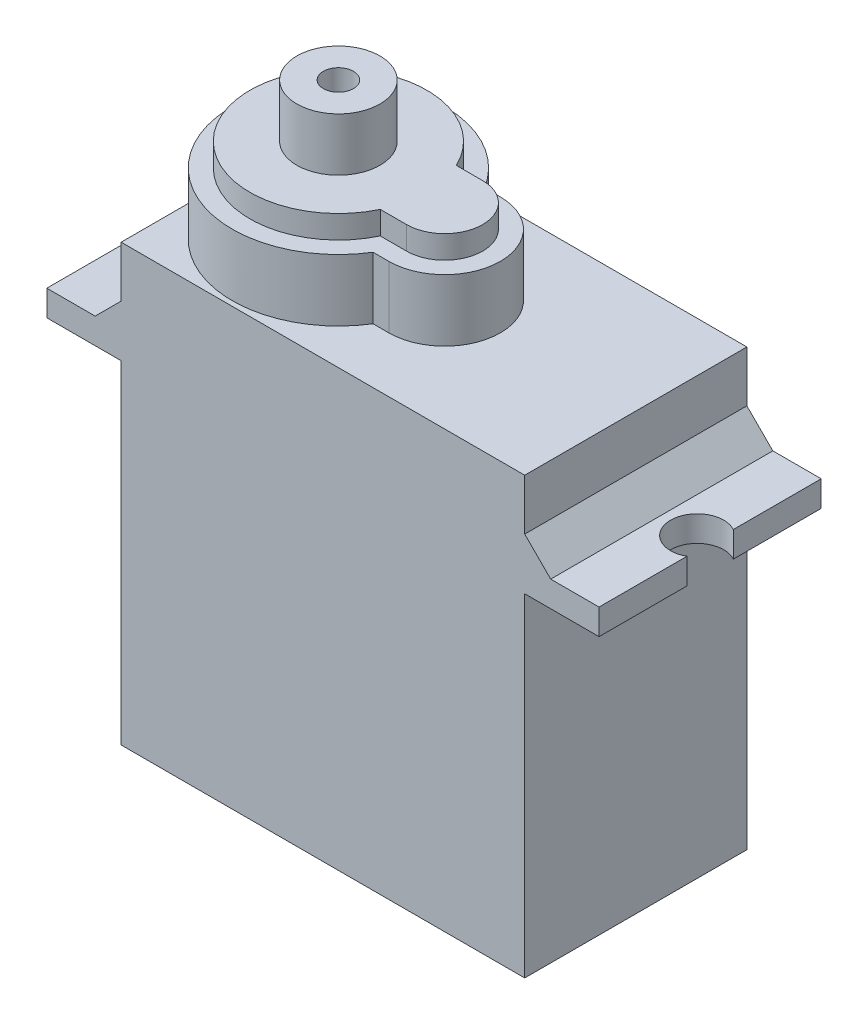
ISO-10303-21;
HEADER;
FILE_DESCRIPTION(('STEP AP214'),'2;1');
FILE_NAME('part.step','',(''),(''),'','','');
FILE_SCHEMA(('AUTOMOTIVE_DESIGN { 1 0 10303 214 1 1 1 1 }'));
ENDSEC;
DATA;
#1=APPLICATION_CONTEXT('core data for automotive mechanical design processes');
#2=APPLICATION_PROTOCOL_DEFINITION('international standard','automotive_design',2000,#1);
#3=PRODUCT_CONTEXT('',#1,'mechanical');
#4=PRODUCT('Part','Part','',(#3));
#5=PRODUCT_RELATED_PRODUCT_CATEGORY('part','',(#4));
#6=PRODUCT_DEFINITION_FORMATION('','',#4);
#7=PRODUCT_DEFINITION_CONTEXT('part definition',#1,'design');
#8=PRODUCT_DEFINITION('design','',#6,#7);
#9=PRODUCT_DEFINITION_SHAPE('','',#8);
#10=(LENGTH_UNIT() NAMED_UNIT(*) SI_UNIT(.MILLI.,.METRE.));
#11=(NAMED_UNIT(*) PLANE_ANGLE_UNIT() SI_UNIT($,.RADIAN.));
#12=(NAMED_UNIT(*) SI_UNIT($,.STERADIAN.) SOLID_ANGLE_UNIT());
#13=UNCERTAINTY_MEASURE_WITH_UNIT(LENGTH_MEASURE(1.E-05),#10,'distance_accuracy_value','');
#14=(GEOMETRIC_REPRESENTATION_CONTEXT(3) GLOBAL_UNCERTAINTY_ASSIGNED_CONTEXT((#13)) GLOBAL_UNIT_ASSIGNED_CONTEXT((#10,
#11,#12)) REPRESENTATION_CONTEXT('',''));
#15=CARTESIAN_POINT('',(0.,0.,0.));
#16=DIRECTION('',(0.,0.,1.));
#17=DIRECTION('',(1.,0.,0.));
#18=AXIS2_PLACEMENT_3D('',#15,#16,#17);
#19=CARTESIAN_POINT('',(15.6,20.25,12.55));
#20=DIRECTION('',(-1.,0.,0.));
#21=DIRECTION('',(0.,0.,1.));
#22=AXIS2_PLACEMENT_3D('',#19,#20,#21);
#23=PLANE('',#22);
#24=DIRECTION('',(0.,0.,-1.));
#25=VECTOR('',#24,1.);
#26=CARTESIAN_POINT('',(15.6,18.8,12.55));
#27=LINE('',#26,#25);
#28=CARTESIAN_POINT('',(15.6,18.8,12.55));
#29=VERTEX_POINT('',#28);
#30=CARTESIAN_POINT('',(15.6,18.8,7.5842057366742));
#31=VERTEX_POINT('',#30);
#32=EDGE_CURVE('E229',#29,#31,#27,.T.);
#33=ORIENTED_EDGE('',*,*,#32,.T.);
#34=DIRECTION('',(0.,1.,0.));
#35=VECTOR('',#34,1.);
#36=CARTESIAN_POINT('',(15.6,-0.001000000000001,7.5842057366742));
#37=LINE('',#36,#35);
#38=CARTESIAN_POINT('',(15.6,20.25,7.5842057366742));
#39=VERTEX_POINT('',#38);
#40=EDGE_CURVE('E215',#39,#31,#37,.F.);
#41=ORIENTED_EDGE('',*,*,#40,.F.);
#42=DIRECTION('',(0.,0.,-1.));
#43=VECTOR('',#42,1.);
#44=CARTESIAN_POINT('',(15.6,20.25,12.55));
#45=LINE('',#44,#43);
#46=CARTESIAN_POINT('',(15.6,20.25,12.55));
#47=VERTEX_POINT('',#46);
#48=EDGE_CURVE('E226',#47,#39,#45,.T.);
#49=ORIENTED_EDGE('',*,*,#48,.F.);
#50=DIRECTION('',(0.,1.,0.));
#51=VECTOR('',#50,1.);
#52=CARTESIAN_POINT('',(15.6,20.25,12.55));
#53=LINE('',#52,#51);
#54=EDGE_CURVE('E317',#29,#47,#53,.T.);
#55=ORIENTED_EDGE('',*,*,#54,.F.);
#56=EDGE_LOOP('',(#33,#41,#49,#55));
#57=FACE_BOUND('',#56,.T.);
#58=ADVANCED_FACE('F39',(#57),#23,.F.);
#59=CARTESIAN_POINT('',(-15.6,20.25,12.55));
#60=DIRECTION('',(1.,0.,0.));
#61=DIRECTION('',(0.,0.,-1.));
#62=AXIS2_PLACEMENT_3D('',#59,#60,#61);
#63=PLANE('',#62);
#64=DIRECTION('',(0.,0.,-1.));
#65=VECTOR('',#64,1.);
#66=CARTESIAN_POINT('',(-15.6,18.8,12.55));
#67=LINE('',#66,#65);
#68=CARTESIAN_POINT('',(-15.6,18.8,4.9657942633258));
#69=VERTEX_POINT('',#68);
#70=CARTESIAN_POINT('',(-15.6,18.8,0.));
#71=VERTEX_POINT('',#70);
#72=EDGE_CURVE('E334',#69,#71,#67,.T.);
#73=ORIENTED_EDGE('',*,*,#72,.F.);
#74=DIRECTION('',(0.,1.,0.));
#75=VECTOR('',#74,1.);
#76=CARTESIAN_POINT('',(-15.6,-0.001000000000001,4.9657942633258));
#77=LINE('',#76,#75);
#78=CARTESIAN_POINT('',(-15.6,20.25,4.9657942633258));
#79=VERTEX_POINT('',#78);
#80=EDGE_CURVE('E422',#79,#69,#77,.F.);
#81=ORIENTED_EDGE('',*,*,#80,.F.);
#82=DIRECTION('',(0.,0.,-1.));
#83=VECTOR('',#82,1.);
#84=CARTESIAN_POINT('',(-15.6,20.25,12.55));
#85=LINE('',#84,#83);
#86=CARTESIAN_POINT('',(-15.6,20.25,0.));
#87=VERTEX_POINT('',#86);
#88=EDGE_CURVE('E369',#79,#87,#85,.T.);
#89=ORIENTED_EDGE('',*,*,#88,.T.);
#90=DIRECTION('',(0.,-1.,0.));
#91=VECTOR('',#90,1.);
#92=CARTESIAN_POINT('',(-15.6,20.25,0.));
#93=LINE('',#92,#91);
#94=EDGE_CURVE('E309',#87,#71,#93,.T.);
#95=ORIENTED_EDGE('',*,*,#94,.T.);
#96=EDGE_LOOP('',(#73,#81,#89,#95));
#97=FACE_BOUND('',#96,.T.);
#98=ADVANCED_FACE('F488',(#97),#63,.F.);
#99=CARTESIAN_POINT('',(-11.4,24.6,12.55));
#100=DIRECTION('',(0.,-1.,0.));
#101=DIRECTION('',(0.,0.,-1.));
#102=AXIS2_PLACEMENT_3D('',#99,#100,#101);
#103=PLANE('',#102);
#104=CARTESIAN_POINT('',(-5.39999999999999,24.6,6.275));
#105=DIRECTION('',(0.,1.,0.));
#106=DIRECTION('',(0.,0.,1.));
#107=AXIS2_PLACEMENT_3D('',#104,#105,#106);
#108=CIRCLE('',#107,6.);
#109=CARTESIAN_POINT('',(-0.293386640835229,24.6,3.125));
#110=VERTEX_POINT('',#109);
#111=CARTESIAN_POINT('',(-11.4,24.6,6.275));
#112=VERTEX_POINT('',#111);
#113=EDGE_CURVE('E257',#110,#112,#108,.T.);
#114=ORIENTED_EDGE('',*,*,#113,.F.);
#115=DIRECTION('',(-1.,0.,0.));
#116=VECTOR('',#115,1.);
#117=CARTESIAN_POINT('',(0.600000000000009,24.6,3.125));
#118=LINE('',#117,#116);
#119=CARTESIAN_POINT('',(0.600000000000009,24.6,3.125));
#120=VERTEX_POINT('',#119);
#121=EDGE_CURVE('E283',#120,#110,#118,.T.);
#122=ORIENTED_EDGE('',*,*,#121,.F.);
#123=CARTESIAN_POINT('',(0.600000000000009,24.6,6.275));
#124=DIRECTION('',(0.,1.,0.));
#125=DIRECTION('',(0.,0.,1.));
#126=AXIS2_PLACEMENT_3D('',#123,#124,#125);
#127=CIRCLE('',#126,3.15);
#128=CARTESIAN_POINT('',(0.600000000000009,24.6,9.425));
#129=VERTEX_POINT('',#128);
#130=EDGE_CURVE('E268',#129,#120,#127,.T.);
#131=ORIENTED_EDGE('',*,*,#130,.F.);
#132=DIRECTION('',(1.,0.,0.));
#133=VECTOR('',#132,1.);
#134=CARTESIAN_POINT('',(0.600000000000009,24.6,9.425));
#135=LINE('',#134,#133);
#136=CARTESIAN_POINT('',(-0.293386640835229,24.6,9.425));
#137=VERTEX_POINT('',#136);
#138=EDGE_CURVE('E264',#137,#129,#135,.T.);
#139=ORIENTED_EDGE('',*,*,#138,.F.);
#140=EDGE_CURVE('E47',#112,#137,#108,.T.);
#141=ORIENTED_EDGE('',*,*,#140,.F.);
#142=DIRECTION('',(0.,0.,-1.));
#143=VECTOR('',#142,1.);
#144=CARTESIAN_POINT('',(-11.4,24.6,12.55));
#145=LINE('',#144,#143);
#146=CARTESIAN_POINT('',(-11.4,24.6,12.55));
#147=VERTEX_POINT('',#146);
#148=EDGE_CURVE('E380',#147,#112,#145,.T.);
#149=ORIENTED_EDGE('',*,*,#148,.F.);
#150=DIRECTION('',(-1.,0.,0.));
#151=VECTOR('',#150,1.);
#152=CARTESIAN_POINT('',(-11.4,24.6,12.55));
#153=LINE('',#152,#151);
#154=CARTESIAN_POINT('',(11.4,24.6,12.55));
#155=VERTEX_POINT('',#154);
#156=EDGE_CURVE('E324',#155,#147,#153,.T.);
#157=ORIENTED_EDGE('',*,*,#156,.F.);
#158=DIRECTION('',(0.,0.,-1.));
#159=VECTOR('',#158,1.);
#160=CARTESIAN_POINT('',(11.4,24.6,12.55));
#161=LINE('',#160,#159);
#162=CARTESIAN_POINT('',(11.4,24.6,0.));
#163=VERTEX_POINT('',#162);
#164=EDGE_CURVE('E383',#155,#163,#161,.T.);
#165=ORIENTED_EDGE('',*,*,#164,.T.);
#166=DIRECTION('',(-1.,0.,0.));
#167=VECTOR('',#166,1.);
#168=CARTESIAN_POINT('',(-11.4,24.6,0.));
#169=LINE('',#168,#167);
#170=CARTESIAN_POINT('',(-11.4,24.6,0.));
#171=VERTEX_POINT('',#170);
#172=EDGE_CURVE('E354',#163,#171,#169,.T.);
#173=ORIENTED_EDGE('',*,*,#172,.T.);
#174=EDGE_CURVE('E379',#112,#171,#145,.T.);
#175=ORIENTED_EDGE('',*,*,#174,.F.);
#176=EDGE_LOOP('',(#114,#122,#131,#139,#141,#149,#157,#165,#173,#175));
#177=FACE_BOUND('',#176,.T.);
#178=ADVANCED_FACE('F407',(#177),#103,.F.);
#179=CARTESIAN_POINT('',(-15.6,18.8,12.55));
#180=DIRECTION('',(0.,1.,0.));
#181=DIRECTION('',(0.,0.,1.));
#182=AXIS2_PLACEMENT_3D('',#179,#180,#181);
#183=PLANE('',#182);
#184=CARTESIAN_POINT('',(-15.6,18.8,12.55));
#185=VERTEX_POINT('',#184);
#186=CARTESIAN_POINT('',(-15.6,18.8,7.5842057366742));
#187=VERTEX_POINT('',#186);
#188=EDGE_CURVE('E366',#185,#187,#67,.T.);
#189=ORIENTED_EDGE('',*,*,#188,.T.);
#190=CARTESIAN_POINT('',(-14.8678932188134,18.8,6.275));
#191=DIRECTION('',(0.,1.,0.));
#192=DIRECTION('',(0.,0.,1.));
#193=AXIS2_PLACEMENT_3D('',#190,#191,#192);
#194=CIRCLE('',#193,1.5);
#195=EDGE_CURVE('E62',#69,#187,#194,.F.);
#196=ORIENTED_EDGE('',*,*,#195,.F.);
#197=ORIENTED_EDGE('',*,*,#72,.T.);
#198=DIRECTION('',(1.,0.,0.));
#199=VECTOR('',#198,1.);
#200=CARTESIAN_POINT('',(-15.6,18.8,0.));
#201=LINE('',#200,#199);
#202=CARTESIAN_POINT('',(-11.4,18.8,0.));
#203=VERTEX_POINT('',#202);
#204=EDGE_CURVE('E304',#71,#203,#201,.T.);
#205=ORIENTED_EDGE('',*,*,#204,.T.);
#206=DIRECTION('',(0.,0.,-1.));
#207=VECTOR('',#206,1.);
#208=CARTESIAN_POINT('',(-11.4,18.8,12.55));
#209=LINE('',#208,#207);
#210=CARTESIAN_POINT('',(-11.4,18.8,12.55));
#211=VERTEX_POINT('',#210);
#212=EDGE_CURVE('E250',#211,#203,#209,.T.);
#213=ORIENTED_EDGE('',*,*,#212,.F.);
#214=DIRECTION('',(1.,0.,0.));
#215=VECTOR('',#214,1.);
#216=CARTESIAN_POINT('',(-15.6,18.8,12.55));
#217=LINE('',#216,#215);
#218=EDGE_CURVE('E305',#185,#211,#217,.T.);
#219=ORIENTED_EDGE('',*,*,#218,.F.);
#220=EDGE_LOOP('',(#189,#196,#197,#205,#213,#219));
#221=FACE_BOUND('',#220,.T.);
#222=ADVANCED_FACE('F41',(#221),#183,.F.);
#223=CARTESIAN_POINT('',(-11.4,18.8,12.55));
#224=DIRECTION('',(1.,0.,0.));
#225=DIRECTION('',(0.,0.,-1.));
#226=AXIS2_PLACEMENT_3D('',#223,#224,#225);
#227=PLANE('',#226);
#228=DIRECTION('',(0.,-1.,0.));
#229=VECTOR('',#228,1.);
#230=CARTESIAN_POINT('',(-11.4,18.8,0.));
#231=LINE('',#230,#229);
#232=CARTESIAN_POINT('',(-11.4,0.,0.));
#233=VERTEX_POINT('',#232);
#234=EDGE_CURVE('E336',#203,#233,#231,.T.);
#235=ORIENTED_EDGE('',*,*,#234,.T.);
#236=DIRECTION('',(0.,0.,-1.));
#237=VECTOR('',#236,1.);
#238=CARTESIAN_POINT('',(-11.4,0.,12.55));
#239=LINE('',#238,#237);
#240=CARTESIAN_POINT('',(-11.4,0.,12.55));
#241=VERTEX_POINT('',#240);
#242=EDGE_CURVE('E248',#241,#233,#239,.T.);
#243=ORIENTED_EDGE('',*,*,#242,.F.);
#244=DIRECTION('',(0.,-1.,0.));
#245=VECTOR('',#244,1.);
#246=CARTESIAN_POINT('',(-11.4,18.8,12.55));
#247=LINE('',#246,#245);
#248=EDGE_CURVE('E308',#211,#241,#247,.T.);
#249=ORIENTED_EDGE('',*,*,#248,.F.);
#250=ORIENTED_EDGE('',*,*,#212,.T.);
#251=EDGE_LOOP('',(#235,#243,#249,#250));
#252=FACE_BOUND('',#251,.T.);
#253=ADVANCED_FACE('F516',(#252),#227,.F.);
#254=CARTESIAN_POINT('',(-11.4,0.,12.55));
#255=DIRECTION('',(0.,1.,0.));
#256=DIRECTION('',(-1.,0.,0.));
#257=AXIS2_PLACEMENT_3D('',#254,#255,#256);
#258=PLANE('',#257);
#259=DIRECTION('',(1.,0.,0.));
#260=VECTOR('',#259,1.);
#261=CARTESIAN_POINT('',(-11.4,0.,0.));
#262=LINE('',#261,#260);
#263=CARTESIAN_POINT('',(11.4,0.,0.));
#264=VERTEX_POINT('',#263);
#265=EDGE_CURVE('E338',#233,#264,#262,.T.);
#266=ORIENTED_EDGE('',*,*,#265,.T.);
#267=DIRECTION('',(0.,0.,-1.));
#268=VECTOR('',#267,1.);
#269=CARTESIAN_POINT('',(11.4,0.,12.55));
#270=LINE('',#269,#268);
#271=CARTESIAN_POINT('',(11.4,0.,12.55));
#272=VERTEX_POINT('',#271);
#273=EDGE_CURVE('E245',#272,#264,#270,.T.);
#274=ORIENTED_EDGE('',*,*,#273,.F.);
#275=DIRECTION('',(1.,0.,0.));
#276=VECTOR('',#275,1.);
#277=CARTESIAN_POINT('',(-11.4,0.,12.55));
#278=LINE('',#277,#276);
#279=EDGE_CURVE('E311',#241,#272,#278,.T.);
#280=ORIENTED_EDGE('',*,*,#279,.F.);
#281=ORIENTED_EDGE('',*,*,#242,.T.);
#282=EDGE_LOOP('',(#266,#274,#280,#281));
#283=FACE_BOUND('',#282,.T.);
#284=ADVANCED_FACE('F513',(#283),#258,.F.);
#285=CARTESIAN_POINT('',(11.4,18.8,12.55));
#286=DIRECTION('',(-1.,0.,0.));
#287=DIRECTION('',(0.,-1.,0.));
#288=AXIS2_PLACEMENT_3D('',#285,#286,#287);
#289=PLANE('',#288);
#290=DIRECTION('',(0.,1.,0.));
#291=VECTOR('',#290,1.);
#292=CARTESIAN_POINT('',(11.4,18.8,0.));
#293=LINE('',#292,#291);
#294=CARTESIAN_POINT('',(11.4,18.8,0.));
#295=VERTEX_POINT('',#294);
#296=EDGE_CURVE('E340',#264,#295,#293,.T.);
#297=ORIENTED_EDGE('',*,*,#296,.T.);
#298=DIRECTION('',(0.,0.,-1.));
#299=VECTOR('',#298,1.);
#300=CARTESIAN_POINT('',(11.4,18.8,12.55));
#301=LINE('',#300,#299);
#302=CARTESIAN_POINT('',(11.4,18.8,12.55));
#303=VERTEX_POINT('',#302);
#304=EDGE_CURVE('E242',#303,#295,#301,.T.);
#305=ORIENTED_EDGE('',*,*,#304,.F.);
#306=DIRECTION('',(0.,1.,0.));
#307=VECTOR('',#306,1.);
#308=CARTESIAN_POINT('',(11.4,18.8,12.55));
#309=LINE('',#308,#307);
#310=EDGE_CURVE('E313',#272,#303,#309,.T.);
#311=ORIENTED_EDGE('',*,*,#310,.F.);
#312=ORIENTED_EDGE('',*,*,#273,.T.);
#313=EDGE_LOOP('',(#297,#305,#311,#312));
#314=FACE_BOUND('',#313,.T.);
#315=ADVANCED_FACE('F505',(#314),#289,.F.);
#316=CARTESIAN_POINT('',(11.4,18.8,12.55));
#317=DIRECTION('',(0.,1.,0.));
#318=DIRECTION('',(0.,0.,1.));
#319=AXIS2_PLACEMENT_3D('',#316,#317,#318);
#320=PLANE('',#319);
#321=CARTESIAN_POINT('',(15.6,18.8,4.96579426332578));
#322=VERTEX_POINT('',#321);
#323=CARTESIAN_POINT('',(15.6,18.8,0.));
#324=VERTEX_POINT('',#323);
#325=EDGE_CURVE('E234',#322,#324,#27,.T.);
#326=ORIENTED_EDGE('',*,*,#325,.F.);
#327=CARTESIAN_POINT('',(14.8678932188134,18.8,6.27499999999999));
#328=DIRECTION('',(0.,1.,0.));
#329=DIRECTION('',(0.,0.,1.));
#330=AXIS2_PLACEMENT_3D('',#327,#328,#329);
#331=CIRCLE('',#330,1.5);
#332=EDGE_CURVE('E220',#31,#322,#331,.F.);
#333=ORIENTED_EDGE('',*,*,#332,.F.);
#334=ORIENTED_EDGE('',*,*,#32,.F.);
#335=DIRECTION('',(1.,0.,0.));
#336=VECTOR('',#335,1.);
#337=CARTESIAN_POINT('',(11.4,18.8,12.55));
#338=LINE('',#337,#336);
#339=EDGE_CURVE('E315',#303,#29,#338,.T.);
#340=ORIENTED_EDGE('',*,*,#339,.F.);
#341=ORIENTED_EDGE('',*,*,#304,.T.);
#342=DIRECTION('',(1.,0.,0.));
#343=VECTOR('',#342,1.);
#344=CARTESIAN_POINT('',(11.4,18.8,0.));
#345=LINE('',#344,#343);
#346=EDGE_CURVE('E342',#295,#324,#345,.T.);
#347=ORIENTED_EDGE('',*,*,#346,.T.);
#348=EDGE_LOOP('',(#326,#333,#334,#340,#341,#347));
#349=FACE_BOUND('',#348,.T.);
#350=ADVANCED_FACE('F419',(#349),#320,.F.);
#351=CARTESIAN_POINT('',(15.6,20.25,4.96579426332578));
#352=VERTEX_POINT('',#351);
#353=CARTESIAN_POINT('',(15.6,20.25,0.));
#354=VERTEX_POINT('',#353);
#355=EDGE_CURVE('E235',#352,#354,#45,.T.);
#356=ORIENTED_EDGE('',*,*,#355,.F.);
#357=DIRECTION('',(0.,1.,0.));
#358=VECTOR('',#357,1.);
#359=CARTESIAN_POINT('',(15.6,-0.001000000000001,4.96579426332578));
#360=LINE('',#359,#358);
#361=EDGE_CURVE('E54',#322,#352,#360,.T.);
#362=ORIENTED_EDGE('',*,*,#361,.F.);
#363=ORIENTED_EDGE('',*,*,#325,.T.);
#364=DIRECTION('',(0.,1.,0.));
#365=VECTOR('',#364,1.);
#366=CARTESIAN_POINT('',(15.6,20.25,0.));
#367=LINE('',#366,#365);
#368=EDGE_CURVE('E345',#324,#354,#367,.T.);
#369=ORIENTED_EDGE('',*,*,#368,.T.);
#370=EDGE_LOOP('',(#356,#362,#363,#369));
#371=FACE_BOUND('',#370,.T.);
#372=ADVANCED_FACE('F490',(#371),#23,.F.);
#373=CARTESIAN_POINT('',(12.8678932188135,20.25,12.55));
#374=DIRECTION('',(0.,-1.,0.));
#375=DIRECTION('',(0.,0.,-1.));
#376=AXIS2_PLACEMENT_3D('',#373,#374,#375);
#377=PLANE('',#376);
#378=ORIENTED_EDGE('',*,*,#48,.T.);
#379=CARTESIAN_POINT('',(14.8678932188134,20.25,6.27499999999999));
#380=DIRECTION('',(0.,1.,0.));
#381=DIRECTION('',(0.,0.,-1.));
#382=AXIS2_PLACEMENT_3D('',#379,#380,#381);
#383=CIRCLE('',#382,1.5);
#384=EDGE_CURVE('E212',#352,#39,#383,.T.);
#385=ORIENTED_EDGE('',*,*,#384,.F.);
#386=ORIENTED_EDGE('',*,*,#355,.T.);
#387=DIRECTION('',(-1.,0.,0.));
#388=VECTOR('',#387,1.);
#389=CARTESIAN_POINT('',(12.8678932188135,20.25,0.));
#390=LINE('',#389,#388);
#391=CARTESIAN_POINT('',(12.8678932188135,20.25,0.));
#392=VERTEX_POINT('',#391);
#393=EDGE_CURVE('E348',#354,#392,#390,.T.);
#394=ORIENTED_EDGE('',*,*,#393,.T.);
#395=DIRECTION('',(0.,0.,-1.));
#396=VECTOR('',#395,1.);
#397=CARTESIAN_POINT('',(12.8678932188135,20.25,12.55));
#398=LINE('',#397,#396);
#399=CARTESIAN_POINT('',(12.8678932188135,20.25,12.55));
#400=VERTEX_POINT('',#399);
#401=EDGE_CURVE('E238',#400,#392,#398,.T.);
#402=ORIENTED_EDGE('',*,*,#401,.F.);
#403=DIRECTION('',(-1.,0.,0.));
#404=VECTOR('',#403,1.);
#405=CARTESIAN_POINT('',(12.8678932188135,20.25,12.55));
#406=LINE('',#405,#404);
#407=EDGE_CURVE('E233',#47,#400,#406,.T.);
#408=ORIENTED_EDGE('',*,*,#407,.F.);
#409=EDGE_LOOP('',(#378,#385,#386,#394,#402,#408));
#410=FACE_BOUND('',#409,.T.);
#411=ADVANCED_FACE('F231',(#410),#377,.F.);
#412=CARTESIAN_POINT('',(11.4,21.7178932188135,12.55));
#413=DIRECTION('',(-0.707106781186538,-0.707106781186557,0.));
#414=DIRECTION('',(0.707106781186557,-0.707106781186538,0.));
#415=AXIS2_PLACEMENT_3D('',#412,#413,#414);
#416=PLANE('',#415);
#417=DIRECTION('',(-0.707106781186557,0.707106781186538,0.));
#418=VECTOR('',#417,1.);
#419=CARTESIAN_POINT('',(11.4,21.7178932188135,0.));
#420=LINE('',#419,#418);
#421=CARTESIAN_POINT('',(11.4,21.7178932188135,0.));
#422=VERTEX_POINT('',#421);
#423=EDGE_CURVE('E350',#392,#422,#420,.T.);
#424=ORIENTED_EDGE('',*,*,#423,.T.);
#425=DIRECTION('',(0.,0.,-1.));
#426=VECTOR('',#425,1.);
#427=CARTESIAN_POINT('',(11.4,21.7178932188135,12.55));
#428=LINE('',#427,#426);
#429=CARTESIAN_POINT('',(11.4,21.7178932188135,12.55));
#430=VERTEX_POINT('',#429);
#431=EDGE_CURVE('E385',#430,#422,#428,.T.);
#432=ORIENTED_EDGE('',*,*,#431,.F.);
#433=DIRECTION('',(-0.707106781186557,0.707106781186538,0.));
#434=VECTOR('',#433,1.);
#435=CARTESIAN_POINT('',(11.4,21.7178932188135,12.55));
#436=LINE('',#435,#434);
#437=EDGE_CURVE('E320',#400,#430,#436,.T.);
#438=ORIENTED_EDGE('',*,*,#437,.F.);
#439=ORIENTED_EDGE('',*,*,#401,.T.);
#440=EDGE_LOOP('',(#424,#432,#438,#439));
#441=FACE_BOUND('',#440,.T.);
#442=ADVANCED_FACE('F395',(#441),#416,.F.);
#443=CARTESIAN_POINT('',(11.4,24.6,12.55));
#444=DIRECTION('',(-1.,0.,0.));
#445=DIRECTION('',(0.,-1.,0.));
#446=AXIS2_PLACEMENT_3D('',#443,#444,#445);
#447=PLANE('',#446);
#448=DIRECTION('',(0.,1.,0.));
#449=VECTOR('',#448,1.);
#450=CARTESIAN_POINT('',(11.4,24.6,0.));
#451=LINE('',#450,#449);
#452=EDGE_CURVE('E352',#422,#163,#451,.T.);
#453=ORIENTED_EDGE('',*,*,#452,.T.);
#454=ORIENTED_EDGE('',*,*,#164,.F.);
#455=DIRECTION('',(0.,1.,0.));
#456=VECTOR('',#455,1.);
#457=CARTESIAN_POINT('',(11.4,24.6,12.55));
#458=LINE('',#457,#456);
#459=EDGE_CURVE('E322',#430,#155,#458,.T.);
#460=ORIENTED_EDGE('',*,*,#459,.F.);
#461=ORIENTED_EDGE('',*,*,#431,.T.);
#462=EDGE_LOOP('',(#453,#454,#460,#461));
#463=FACE_BOUND('',#462,.T.);
#464=ADVANCED_FACE('F404',(#463),#447,.F.);
#465=CARTESIAN_POINT('',(-11.4,24.6,12.55));
#466=DIRECTION('',(1.,0.,0.));
#467=DIRECTION('',(0.,0.,-1.));
#468=AXIS2_PLACEMENT_3D('',#465,#466,#467);
#469=PLANE('',#468);
#470=DIRECTION('',(0.,-1.,0.));
#471=VECTOR('',#470,1.);
#472=CARTESIAN_POINT('',(-11.4,24.6,0.));
#473=LINE('',#472,#471);
#474=CARTESIAN_POINT('',(-11.4,21.7178932188135,0.));
#475=VERTEX_POINT('',#474);
#476=EDGE_CURVE('E357',#171,#475,#473,.T.);
#477=ORIENTED_EDGE('',*,*,#476,.T.);
#478=DIRECTION('',(0.,0.,-1.));
#479=VECTOR('',#478,1.);
#480=CARTESIAN_POINT('',(-11.4,21.7178932188135,12.55));
#481=LINE('',#480,#479);
#482=CARTESIAN_POINT('',(-11.4,21.7178932188135,12.55));
#483=VERTEX_POINT('',#482);
#484=EDGE_CURVE('E376',#483,#475,#481,.T.);
#485=ORIENTED_EDGE('',*,*,#484,.F.);
#486=DIRECTION('',(0.,-1.,0.));
#487=VECTOR('',#486,1.);
#488=CARTESIAN_POINT('',(-11.4,24.6,12.55));
#489=LINE('',#488,#487);
#490=EDGE_CURVE('E326',#147,#483,#489,.T.);
#491=ORIENTED_EDGE('',*,*,#490,.F.);
#492=ORIENTED_EDGE('',*,*,#148,.T.);
#493=ORIENTED_EDGE('',*,*,#174,.T.);
#494=EDGE_LOOP('',(#477,#485,#491,#492,#493));
#495=FACE_BOUND('',#494,.T.);
#496=ADVANCED_FACE('F536',(#495),#469,.F.);
#497=CARTESIAN_POINT('',(-11.4,21.7178932188135,12.55));
#498=DIRECTION('',(0.707106781186548,-0.707106781186548,0.));
#499=DIRECTION('',(0.707106781186548,0.707106781186548,0.));
#500=AXIS2_PLACEMENT_3D('',#497,#498,#499);
#501=PLANE('',#500);
#502=DIRECTION('',(-0.707106781186548,-0.707106781186548,0.));
#503=VECTOR('',#502,1.);
#504=CARTESIAN_POINT('',(-11.4,21.7178932188135,0.));
#505=LINE('',#504,#503);
#506=CARTESIAN_POINT('',(-12.8678932188134,20.25,0.));
#507=VERTEX_POINT('',#506);
#508=EDGE_CURVE('E359',#475,#507,#505,.T.);
#509=ORIENTED_EDGE('',*,*,#508,.T.);
#510=DIRECTION('',(0.,0.,-1.));
#511=VECTOR('',#510,1.);
#512=CARTESIAN_POINT('',(-12.8678932188134,20.25,12.55));
#513=LINE('',#512,#511);
#514=CARTESIAN_POINT('',(-12.8678932188134,20.25,12.55));
#515=VERTEX_POINT('',#514);
#516=EDGE_CURVE('E373',#515,#507,#513,.T.);
#517=ORIENTED_EDGE('',*,*,#516,.F.);
#518=DIRECTION('',(-0.707106781186548,-0.707106781186548,0.));
#519=VECTOR('',#518,1.);
#520=CARTESIAN_POINT('',(-11.4,21.7178932188135,12.55));
#521=LINE('',#520,#519);
#522=EDGE_CURVE('E328',#483,#515,#521,.T.);
#523=ORIENTED_EDGE('',*,*,#522,.F.);
#524=ORIENTED_EDGE('',*,*,#484,.T.);
#525=EDGE_LOOP('',(#509,#517,#523,#524));
#526=FACE_BOUND('',#525,.T.);
#527=ADVANCED_FACE('F534',(#526),#501,.F.);
#528=CARTESIAN_POINT('',(-15.6,20.25,12.55));
#529=DIRECTION('',(0.,-1.,0.));
#530=DIRECTION('',(0.,0.,-1.));
#531=AXIS2_PLACEMENT_3D('',#528,#529,#530);
#532=PLANE('',#531);
#533=ORIENTED_EDGE('',*,*,#88,.F.);
#534=CARTESIAN_POINT('',(-14.8678932188134,20.25,6.275));
#535=DIRECTION('',(0.,1.,0.));
#536=DIRECTION('',(0.,0.,1.));
#537=AXIS2_PLACEMENT_3D('',#534,#535,#536);
#538=CIRCLE('',#537,1.5);
#539=CARTESIAN_POINT('',(-15.6,20.25,7.5842057366742));
#540=VERTEX_POINT('',#539);
#541=EDGE_CURVE('E426',#540,#79,#538,.T.);
#542=ORIENTED_EDGE('',*,*,#541,.F.);
#543=CARTESIAN_POINT('',(-15.6,20.25,12.55));
#544=VERTEX_POINT('',#543);
#545=EDGE_CURVE('E370',#544,#540,#85,.T.);
#546=ORIENTED_EDGE('',*,*,#545,.F.);
#547=DIRECTION('',(-1.,0.,0.));
#548=VECTOR('',#547,1.);
#549=CARTESIAN_POINT('',(-15.6,20.25,12.55));
#550=LINE('',#549,#548);
#551=EDGE_CURVE('E330',#515,#544,#550,.T.);
#552=ORIENTED_EDGE('',*,*,#551,.F.);
#553=ORIENTED_EDGE('',*,*,#516,.T.);
#554=DIRECTION('',(-1.,0.,0.));
#555=VECTOR('',#554,1.);
#556=CARTESIAN_POINT('',(-15.6,20.25,0.));
#557=LINE('',#556,#555);
#558=EDGE_CURVE('E361',#507,#87,#557,.T.);
#559=ORIENTED_EDGE('',*,*,#558,.T.);
#560=EDGE_LOOP('',(#533,#542,#546,#552,#553,#559));
#561=FACE_BOUND('',#560,.T.);
#562=ADVANCED_FACE('F527',(#561),#532,.F.);
#563=ORIENTED_EDGE('',*,*,#545,.T.);
#564=DIRECTION('',(0.,1.,0.));
#565=VECTOR('',#564,1.);
#566=CARTESIAN_POINT('',(-15.6,-0.001000000000001,7.5842057366742));
#567=LINE('',#566,#565);
#568=EDGE_CURVE('E420',#187,#540,#567,.T.);
#569=ORIENTED_EDGE('',*,*,#568,.F.);
#570=ORIENTED_EDGE('',*,*,#188,.F.);
#571=DIRECTION('',(0.,-1.,0.));
#572=VECTOR('',#571,1.);
#573=CARTESIAN_POINT('',(-15.6,20.25,12.55));
#574=LINE('',#573,#572);
#575=EDGE_CURVE('E332',#544,#185,#574,.T.);
#576=ORIENTED_EDGE('',*,*,#575,.F.);
#577=EDGE_LOOP('',(#563,#569,#570,#576));
#578=FACE_BOUND('',#577,.T.);
#579=ADVANCED_FACE('F496',(#578),#63,.F.);
#580=CARTESIAN_POINT('',(0.,0.,12.55));
#581=DIRECTION('',(0.,0.,-1.));
#582=DIRECTION('',(-1.,0.,0.));
#583=AXIS2_PLACEMENT_3D('',#580,#581,#582);
#584=PLANE('',#583);
#585=ORIENTED_EDGE('',*,*,#218,.T.);
#586=ORIENTED_EDGE('',*,*,#248,.T.);
#587=ORIENTED_EDGE('',*,*,#279,.T.);
#588=ORIENTED_EDGE('',*,*,#310,.T.);
#589=ORIENTED_EDGE('',*,*,#339,.T.);
#590=ORIENTED_EDGE('',*,*,#54,.T.);
#591=ORIENTED_EDGE('',*,*,#407,.T.);
#592=ORIENTED_EDGE('',*,*,#437,.T.);
#593=ORIENTED_EDGE('',*,*,#459,.T.);
#594=ORIENTED_EDGE('',*,*,#156,.T.);
#595=ORIENTED_EDGE('',*,*,#490,.T.);
#596=ORIENTED_EDGE('',*,*,#522,.T.);
#597=ORIENTED_EDGE('',*,*,#551,.T.);
#598=ORIENTED_EDGE('',*,*,#575,.T.);
#599=EDGE_LOOP('',(#585,#586,#587,#588,#589,#590,#591,#592,#593,#594,#595,#596,#597,#598));
#600=FACE_BOUND('',#599,.T.);
#601=ADVANCED_FACE('F412',(#600),#584,.F.);
#602=CARTESIAN_POINT('',(0.,0.,0.));
#603=DIRECTION('',(0.,0.,-1.));
#604=DIRECTION('',(-1.,0.,0.));
#605=AXIS2_PLACEMENT_3D('',#602,#603,#604);
#606=PLANE('',#605);
#607=ORIENTED_EDGE('',*,*,#204,.F.);
#608=ORIENTED_EDGE('',*,*,#94,.F.);
#609=ORIENTED_EDGE('',*,*,#558,.F.);
#610=ORIENTED_EDGE('',*,*,#508,.F.);
#611=ORIENTED_EDGE('',*,*,#476,.F.);
#612=ORIENTED_EDGE('',*,*,#172,.F.);
#613=ORIENTED_EDGE('',*,*,#452,.F.);
#614=ORIENTED_EDGE('',*,*,#423,.F.);
#615=ORIENTED_EDGE('',*,*,#393,.F.);
#616=ORIENTED_EDGE('',*,*,#368,.F.);
#617=ORIENTED_EDGE('',*,*,#346,.F.);
#618=ORIENTED_EDGE('',*,*,#296,.F.);
#619=ORIENTED_EDGE('',*,*,#265,.F.);
#620=ORIENTED_EDGE('',*,*,#234,.F.);
#621=EDGE_LOOP('',(#607,#608,#609,#610,#611,#612,#613,#614,#615,#616,#617,#618,#619,#620));
#622=FACE_BOUND('',#621,.T.);
#623=ADVANCED_FACE('F399',(#622),#606,.T.);
#624=CARTESIAN_POINT('',(-5.39999999999999,28.1,6.275));
#625=DIRECTION('',(0.,-1.,0.));
#626=DIRECTION('',(0.,0.,-1.));
#627=AXIS2_PLACEMENT_3D('',#624,#625,#626);
#628=CYLINDRICAL_SURFACE('',#627,6.);
#629=ORIENTED_EDGE('',*,*,#113,.T.);
#630=ORIENTED_EDGE('',*,*,#140,.T.);
#631=DIRECTION('',(0.,-1.,0.));
#632=VECTOR('',#631,1.);
#633=CARTESIAN_POINT('',(-0.293386640835229,28.1,9.425));
#634=LINE('',#633,#632);
#635=CARTESIAN_POINT('',(-0.293386640835229,28.1,9.425));
#636=VERTEX_POINT('',#635);
#637=EDGE_CURVE('E302',#636,#137,#634,.T.);
#638=ORIENTED_EDGE('',*,*,#637,.F.);
#639=CARTESIAN_POINT('',(-5.39999999999999,28.1,6.275));
#640=DIRECTION('',(0.,1.,0.));
#641=DIRECTION('',(0.,0.,1.));
#642=AXIS2_PLACEMENT_3D('',#639,#640,#641);
#643=CIRCLE('',#642,6.);
#644=CARTESIAN_POINT('',(-0.293386640835229,28.1,3.125));
#645=VERTEX_POINT('',#644);
#646=EDGE_CURVE('E279',#645,#636,#643,.T.);
#647=ORIENTED_EDGE('',*,*,#646,.F.);
#648=DIRECTION('',(0.,-1.,0.));
#649=VECTOR('',#648,1.);
#650=CARTESIAN_POINT('',(-0.293386640835229,28.1,3.125));
#651=LINE('',#650,#649);
#652=EDGE_CURVE('E287',#645,#110,#651,.T.);
#653=ORIENTED_EDGE('',*,*,#652,.T.);
#654=EDGE_LOOP('',(#629,#630,#638,#647,#653));
#655=FACE_BOUND('',#654,.T.);
#656=ADVANCED_FACE('F548',(#655),#628,.T.);
#657=CARTESIAN_POINT('',(0.600000000000009,28.1,9.425));
#658=DIRECTION('',(0.,0.,-1.));
#659=DIRECTION('',(-1.,0.,0.));
#660=AXIS2_PLACEMENT_3D('',#657,#658,#659);
#661=PLANE('',#660);
#662=ORIENTED_EDGE('',*,*,#138,.T.);
#663=DIRECTION('',(0.,-1.,0.));
#664=VECTOR('',#663,1.);
#665=CARTESIAN_POINT('',(0.600000000000009,28.1,9.425));
#666=LINE('',#665,#664);
#667=CARTESIAN_POINT('',(0.600000000000009,28.1,9.425));
#668=VERTEX_POINT('',#667);
#669=EDGE_CURVE('E295',#668,#129,#666,.T.);
#670=ORIENTED_EDGE('',*,*,#669,.F.);
#671=DIRECTION('',(1.,0.,0.));
#672=VECTOR('',#671,1.);
#673=CARTESIAN_POINT('',(0.600000000000009,28.1,9.425));
#674=LINE('',#673,#672);
#675=EDGE_CURVE('E282',#636,#668,#674,.T.);
#676=ORIENTED_EDGE('',*,*,#675,.F.);
#677=ORIENTED_EDGE('',*,*,#637,.T.);
#678=EDGE_LOOP('',(#662,#670,#676,#677));
#679=FACE_BOUND('',#678,.T.);
#680=ADVANCED_FACE('F547',(#679),#661,.F.);
#681=CARTESIAN_POINT('',(0.600000000000009,28.1,6.275));
#682=DIRECTION('',(0.,-1.,0.));
#683=DIRECTION('',(0.,0.,-1.));
#684=AXIS2_PLACEMENT_3D('',#681,#682,#683);
#685=CYLINDRICAL_SURFACE('',#684,3.15);
#686=ORIENTED_EDGE('',*,*,#130,.T.);
#687=DIRECTION('',(0.,-1.,0.));
#688=VECTOR('',#687,1.);
#689=CARTESIAN_POINT('',(0.600000000000009,28.1,3.125));
#690=LINE('',#689,#688);
#691=CARTESIAN_POINT('',(0.600000000000009,28.1,3.125));
#692=VERTEX_POINT('',#691);
#693=EDGE_CURVE('E291',#692,#120,#690,.T.);
#694=ORIENTED_EDGE('',*,*,#693,.F.);
#695=CARTESIAN_POINT('',(0.600000000000009,28.1,6.275));
#696=DIRECTION('',(0.,1.,0.));
#697=DIRECTION('',(0.,0.,1.));
#698=AXIS2_PLACEMENT_3D('',#695,#696,#697);
#699=CIRCLE('',#698,3.15);
#700=EDGE_CURVE('E285',#668,#692,#699,.T.);
#701=ORIENTED_EDGE('',*,*,#700,.F.);
#702=ORIENTED_EDGE('',*,*,#669,.T.);
#703=EDGE_LOOP('',(#686,#694,#701,#702));
#704=FACE_BOUND('',#703,.T.);
#705=ADVANCED_FACE('F543',(#704),#685,.T.);
#706=CARTESIAN_POINT('',(0.600000000000009,28.1,3.125));
#707=DIRECTION('',(0.,0.,1.));
#708=DIRECTION('',(1.,0.,0.));
#709=AXIS2_PLACEMENT_3D('',#706,#707,#708);
#710=PLANE('',#709);
#711=ORIENTED_EDGE('',*,*,#121,.T.);
#712=ORIENTED_EDGE('',*,*,#652,.F.);
#713=DIRECTION('',(-1.,0.,0.));
#714=VECTOR('',#713,1.);
#715=CARTESIAN_POINT('',(0.600000000000009,28.1,3.125));
#716=LINE('',#715,#714);
#717=EDGE_CURVE('E286',#692,#645,#716,.T.);
#718=ORIENTED_EDGE('',*,*,#717,.F.);
#719=ORIENTED_EDGE('',*,*,#693,.T.);
#720=EDGE_LOOP('',(#711,#712,#718,#719));
#721=FACE_BOUND('',#720,.T.);
#722=ADVANCED_FACE('F540',(#721),#710,.F.);
#723=CARTESIAN_POINT('',(-5.39999999999999,28.1,6.275));
#724=DIRECTION('',(0.,1.,0.));
#725=DIRECTION('',(0.,0.,1.));
#726=AXIS2_PLACEMENT_3D('',#723,#724,#725);
#727=PLANE('',#726);
#728=CARTESIAN_POINT('',(0.600000000000009,28.1,6.275));
#729=DIRECTION('',(0.,1.,0.));
#730=DIRECTION('',(0.,0.,1.));
#731=AXIS2_PLACEMENT_3D('',#728,#729,#730);
#732=CIRCLE('',#731,2.15);
#733=CARTESIAN_POINT('',(0.600000000000009,28.1,8.425));
#734=VERTEX_POINT('',#733);
#735=CARTESIAN_POINT('',(0.600000000000009,28.1,4.125));
#736=VERTEX_POINT('',#735);
#737=EDGE_CURVE('E451',#734,#736,#732,.T.);
#738=ORIENTED_EDGE('',*,*,#737,.F.);
#739=DIRECTION('',(1.,0.,0.));
#740=VECTOR('',#739,1.);
#741=CARTESIAN_POINT('',(0.,28.1,8.425));
#742=LINE('',#741,#740);
#743=CARTESIAN_POINT('',(-0.885855562789323,28.1,8.425));
#744=VERTEX_POINT('',#743);
#745=EDGE_CURVE('E436',#744,#734,#742,.T.);
#746=ORIENTED_EDGE('',*,*,#745,.F.);
#747=CARTESIAN_POINT('',(-5.39999999999999,28.1,6.275));
#748=DIRECTION('',(0.,1.,0.));
#749=DIRECTION('',(0.,0.,1.));
#750=AXIS2_PLACEMENT_3D('',#747,#748,#749);
#751=CIRCLE('',#750,5.);
#752=CARTESIAN_POINT('',(-0.885855562789324,28.1,4.125));
#753=VERTEX_POINT('',#752);
#754=EDGE_CURVE('E443',#753,#744,#751,.T.);
#755=ORIENTED_EDGE('',*,*,#754,.F.);
#756=DIRECTION('',(-1.,0.,0.));
#757=VECTOR('',#756,1.);
#758=CARTESIAN_POINT('',(0.,28.1,4.125));
#759=LINE('',#758,#757);
#760=EDGE_CURVE('E453',#736,#753,#759,.T.);
#761=ORIENTED_EDGE('',*,*,#760,.F.);
#762=EDGE_LOOP('',(#738,#746,#755,#761));
#763=FACE_BOUND('',#762,.T.);
#764=ORIENTED_EDGE('',*,*,#646,.T.);
#765=ORIENTED_EDGE('',*,*,#675,.T.);
#766=ORIENTED_EDGE('',*,*,#700,.T.);
#767=ORIENTED_EDGE('',*,*,#717,.T.);
#768=EDGE_LOOP('',(#764,#765,#766,#767));
#769=FACE_BOUND('',#768,.T.);
#770=ADVANCED_FACE('F472',(#763,#769),#727,.T.);
#771=CARTESIAN_POINT('',(0.,29.4,8.425));
#772=DIRECTION('',(0.,0.,-1.));
#773=DIRECTION('',(-1.,0.,0.));
#774=AXIS2_PLACEMENT_3D('',#771,#772,#773);
#775=PLANE('',#774);
#776=ORIENTED_EDGE('',*,*,#745,.T.);
#777=DIRECTION('',(0.,-1.,0.));
#778=VECTOR('',#777,1.);
#779=CARTESIAN_POINT('',(0.600000000000009,29.4,8.425));
#780=LINE('',#779,#778);
#781=CARTESIAN_POINT('',(0.600000000000009,29.4,8.425));
#782=VERTEX_POINT('',#781);
#783=EDGE_CURVE('E265',#782,#734,#780,.T.);
#784=ORIENTED_EDGE('',*,*,#783,.F.);
#785=DIRECTION('',(1.,0.,0.));
#786=VECTOR('',#785,1.);
#787=CARTESIAN_POINT('',(0.,29.4,8.425));
#788=LINE('',#787,#786);
#789=CARTESIAN_POINT('',(-0.885855562789323,29.4,8.425));
#790=VERTEX_POINT('',#789);
#791=EDGE_CURVE('E439',#790,#782,#788,.T.);
#792=ORIENTED_EDGE('',*,*,#791,.F.);
#793=DIRECTION('',(0.,-1.,0.));
#794=VECTOR('',#793,1.);
#795=CARTESIAN_POINT('',(-0.885855562789323,29.4,8.425));
#796=LINE('',#795,#794);
#797=EDGE_CURVE('E449',#790,#744,#796,.T.);
#798=ORIENTED_EDGE('',*,*,#797,.T.);
#799=EDGE_LOOP('',(#776,#784,#792,#798));
#800=FACE_BOUND('',#799,.T.);
#801=ADVANCED_FACE('F474',(#800),#775,.F.);
#802=CARTESIAN_POINT('',(0.600000000000009,29.4,6.275));
#803=DIRECTION('',(0.,-1.,0.));
#804=DIRECTION('',(0.,0.,-1.));
#805=AXIS2_PLACEMENT_3D('',#802,#803,#804);
#806=CYLINDRICAL_SURFACE('',#805,2.15);
#807=ORIENTED_EDGE('',*,*,#737,.T.);
#808=DIRECTION('',(0.,-1.,0.));
#809=VECTOR('',#808,1.);
#810=CARTESIAN_POINT('',(0.600000000000009,29.4,4.125));
#811=LINE('',#810,#809);
#812=CARTESIAN_POINT('',(0.600000000000009,29.4,4.125));
#813=VERTEX_POINT('',#812);
#814=EDGE_CURVE('E269',#813,#736,#811,.T.);
#815=ORIENTED_EDGE('',*,*,#814,.F.);
#816=CARTESIAN_POINT('',(0.600000000000009,29.4,6.275));
#817=DIRECTION('',(0.,1.,0.));
#818=DIRECTION('',(0.,0.,1.));
#819=AXIS2_PLACEMENT_3D('',#816,#817,#818);
#820=CIRCLE('',#819,2.15);
#821=EDGE_CURVE('E442',#782,#813,#820,.T.);
#822=ORIENTED_EDGE('',*,*,#821,.F.);
#823=ORIENTED_EDGE('',*,*,#783,.T.);
#824=EDGE_LOOP('',(#807,#815,#822,#823));
#825=FACE_BOUND('',#824,.T.);
#826=ADVANCED_FACE('F478',(#825),#806,.T.);
#827=CARTESIAN_POINT('',(0.,29.4,4.125));
#828=DIRECTION('',(0.,0.,1.));
#829=DIRECTION('',(1.,0.,0.));
#830=AXIS2_PLACEMENT_3D('',#827,#828,#829);
#831=PLANE('',#830);
#832=ORIENTED_EDGE('',*,*,#760,.T.);
#833=DIRECTION('',(0.,-1.,0.));
#834=VECTOR('',#833,1.);
#835=CARTESIAN_POINT('',(-0.885855562789324,29.4,4.125));
#836=LINE('',#835,#834);
#837=CARTESIAN_POINT('',(-0.885855562789324,29.4,4.125));
#838=VERTEX_POINT('',#837);
#839=EDGE_CURVE('E275',#838,#753,#836,.T.);
#840=ORIENTED_EDGE('',*,*,#839,.F.);
#841=DIRECTION('',(-1.,0.,0.));
#842=VECTOR('',#841,1.);
#843=CARTESIAN_POINT('',(0.,29.4,4.125));
#844=LINE('',#843,#842);
#845=EDGE_CURVE('E445',#813,#838,#844,.T.);
#846=ORIENTED_EDGE('',*,*,#845,.F.);
#847=ORIENTED_EDGE('',*,*,#814,.T.);
#848=EDGE_LOOP('',(#832,#840,#846,#847));
#849=FACE_BOUND('',#848,.T.);
#850=ADVANCED_FACE('F467',(#849),#831,.F.);
#851=CARTESIAN_POINT('',(-5.39999999999999,29.4,6.275));
#852=DIRECTION('',(0.,-1.,0.));
#853=DIRECTION('',(0.,0.,-1.));
#854=AXIS2_PLACEMENT_3D('',#851,#852,#853);
#855=CYLINDRICAL_SURFACE('',#854,5.);
#856=ORIENTED_EDGE('',*,*,#754,.T.);
#857=ORIENTED_EDGE('',*,*,#797,.F.);
#858=CARTESIAN_POINT('',(-5.39999999999999,29.4,6.275));
#859=DIRECTION('',(0.,1.,0.));
#860=DIRECTION('',(0.,0.,1.));
#861=AXIS2_PLACEMENT_3D('',#858,#859,#860);
#862=CIRCLE('',#861,5.);
#863=EDGE_CURVE('E447',#838,#790,#862,.T.);
#864=ORIENTED_EDGE('',*,*,#863,.F.);
#865=ORIENTED_EDGE('',*,*,#839,.T.);
#866=EDGE_LOOP('',(#856,#857,#864,#865));
#867=FACE_BOUND('',#866,.T.);
#868=ADVANCED_FACE('F461',(#867),#855,.T.);
#869=CARTESIAN_POINT('',(0.,29.4,0.));
#870=DIRECTION('',(0.,1.,0.));
#871=DIRECTION('',(0.,0.,1.));
#872=AXIS2_PLACEMENT_3D('',#869,#870,#871);
#873=PLANE('',#872);
#874=CARTESIAN_POINT('',(-5.39999999999999,29.4,6.275));
#875=DIRECTION('',(0.,1.,0.));
#876=DIRECTION('',(0.,0.,1.));
#877=AXIS2_PLACEMENT_3D('',#874,#875,#876);
#878=CIRCLE('',#877,2.35);
#879=CARTESIAN_POINT('',(-5.39999999999999,29.4,8.625));
#880=VERTEX_POINT('',#879);
#881=EDGE_CURVE('E432',#880,#880,#878,.T.);
#882=ORIENTED_EDGE('',*,*,#881,.F.);
#883=EDGE_LOOP('',(#882));
#884=FACE_BOUND('',#883,.T.);
#885=ORIENTED_EDGE('',*,*,#791,.T.);
#886=ORIENTED_EDGE('',*,*,#821,.T.);
#887=ORIENTED_EDGE('',*,*,#845,.T.);
#888=ORIENTED_EDGE('',*,*,#863,.T.);
#889=EDGE_LOOP('',(#885,#886,#887,#888));
#890=FACE_BOUND('',#889,.T.);
#891=ADVANCED_FACE('F477',(#884,#890),#873,.T.);
#892=CARTESIAN_POINT('',(-5.39999999999999,32.4,6.275));
#893=DIRECTION('',(0.,1.,0.));
#894=DIRECTION('',(0.,0.,1.));
#895=AXIS2_PLACEMENT_3D('',#892,#893,#894);
#896=PLANE('',#895);
#897=CARTESIAN_POINT('',(-5.39999999999999,32.4,6.275));
#898=DIRECTION('',(0.,1.,0.));
#899=DIRECTION('',(0.,0.,1.));
#900=AXIS2_PLACEMENT_3D('',#897,#898,#899);
#901=CIRCLE('',#900,2.35);
#902=CARTESIAN_POINT('',(-5.39999999999999,32.4,8.625));
#903=VERTEX_POINT('',#902);
#904=EDGE_CURVE('E433',#903,#903,#901,.T.);
#905=ORIENTED_EDGE('',*,*,#904,.T.);
#906=EDGE_LOOP('',(#905));
#907=FACE_BOUND('',#906,.T.);
#908=CARTESIAN_POINT('',(-5.39999999999999,32.4,6.275));
#909=DIRECTION('',(0.,1.,0.));
#910=DIRECTION('',(0.,0.,1.));
#911=AXIS2_PLACEMENT_3D('',#908,#909,#910);
#912=CIRCLE('',#911,0.85);
#913=CARTESIAN_POINT('',(-5.39999999999999,32.4,7.125));
#914=VERTEX_POINT('',#913);
#915=EDGE_CURVE('E429',#914,#914,#912,.T.);
#916=ORIENTED_EDGE('',*,*,#915,.F.);
#917=EDGE_LOOP('',(#916));
#918=FACE_BOUND('',#917,.T.);
#919=ADVANCED_FACE('F667',(#907,#918),#896,.T.);
#920=CARTESIAN_POINT('',(-5.39999999999999,32.4,6.275));
#921=DIRECTION('',(0.,-1.,0.));
#922=DIRECTION('',(0.,0.,-1.));
#923=AXIS2_PLACEMENT_3D('',#920,#921,#922);
#924=CYLINDRICAL_SURFACE('',#923,2.35);
#925=ORIENTED_EDGE('',*,*,#904,.F.);
#926=EDGE_LOOP('',(#925));
#927=FACE_BOUND('',#926,.T.);
#928=ORIENTED_EDGE('',*,*,#881,.T.);
#929=EDGE_LOOP('',(#928));
#930=FACE_BOUND('',#929,.T.);
#931=ADVANCED_FACE('F679',(#927,#930),#924,.T.);
#932=CARTESIAN_POINT('',(-5.39999999999999,32.4,6.275));
#933=DIRECTION('',(0.,-1.,0.));
#934=DIRECTION('',(0.,0.,-1.));
#935=AXIS2_PLACEMENT_3D('',#932,#933,#934);
#936=CYLINDRICAL_SURFACE('',#935,0.85);
#937=ORIENTED_EDGE('',*,*,#915,.T.);
#938=EDGE_LOOP('',(#937));
#939=FACE_BOUND('',#938,.T.);
#940=CARTESIAN_POINT('',(-5.39999999999999,29.4,6.275));
#941=DIRECTION('',(0.,1.,0.));
#942=DIRECTION('',(0.,0.,1.));
#943=AXIS2_PLACEMENT_3D('',#940,#941,#942);
#944=CIRCLE('',#943,0.85);
#945=CARTESIAN_POINT('',(-5.39999999999999,29.4,7.125));
#946=VERTEX_POINT('',#945);
#947=EDGE_CURVE('E11',#946,#946,#944,.F.);
#948=ORIENTED_EDGE('',*,*,#947,.T.);
#949=EDGE_LOOP('',(#948));
#950=FACE_BOUND('',#949,.T.);
#951=ADVANCED_FACE('F689',(#939,#950),#936,.F.);
#952=ORIENTED_EDGE('',*,*,#947,.F.);
#953=EDGE_LOOP('',(#952));
#954=FACE_BOUND('',#953,.T.);
#955=ADVANCED_FACE('F670',(#954),#873,.T.);
#956=CARTESIAN_POINT('',(-14.8678932188134,-0.001000000000001,6.275));
#957=DIRECTION('',(0.,1.,0.));
#958=DIRECTION('',(0.,0.,1.));
#959=AXIS2_PLACEMENT_3D('',#956,#957,#958);
#960=CYLINDRICAL_SURFACE('',#959,1.5);
#961=ORIENTED_EDGE('',*,*,#80,.T.);
#962=ORIENTED_EDGE('',*,*,#195,.T.);
#963=ORIENTED_EDGE('',*,*,#568,.T.);
#964=ORIENTED_EDGE('',*,*,#541,.T.);
#965=EDGE_LOOP('',(#961,#962,#963,#964));
#966=FACE_BOUND('',#965,.T.);
#967=ADVANCED_FACE('F707',(#966),#960,.F.);
#968=CARTESIAN_POINT('',(14.8678932188134,-0.001000000000001,6.27499999999999));
#969=DIRECTION('',(0.,1.,0.));
#970=DIRECTION('',(0.,0.,1.));
#971=AXIS2_PLACEMENT_3D('',#968,#969,#970);
#972=CYLINDRICAL_SURFACE('',#971,1.5);
#973=ORIENTED_EDGE('',*,*,#40,.T.);
#974=ORIENTED_EDGE('',*,*,#332,.T.);
#975=ORIENTED_EDGE('',*,*,#361,.T.);
#976=ORIENTED_EDGE('',*,*,#384,.T.);
#977=EDGE_LOOP('',(#973,#974,#975,#976));
#978=FACE_BOUND('',#977,.T.);
#979=ADVANCED_FACE('F214',(#978),#972,.F.);
#980=CLOSED_SHELL('',(#58,#98,#178,#222,#253,#284,#315,#350,#372,#411,#442,#464,#496,#527,#562,
#579,#601,#623,#656,#680,#705,#722,#770,#801,#826,#850,#868,#891,#919,#931,#951,#955,#967,#979));
#981=MANIFOLD_SOLID_BREP('B2',#980);
#982=ADVANCED_BREP_SHAPE_REPRESENTATION('',(#18,#981),#14);
#983=SHAPE_DEFINITION_REPRESENTATION(#9,#982);
ENDSEC;
END-ISO-10303-21;
